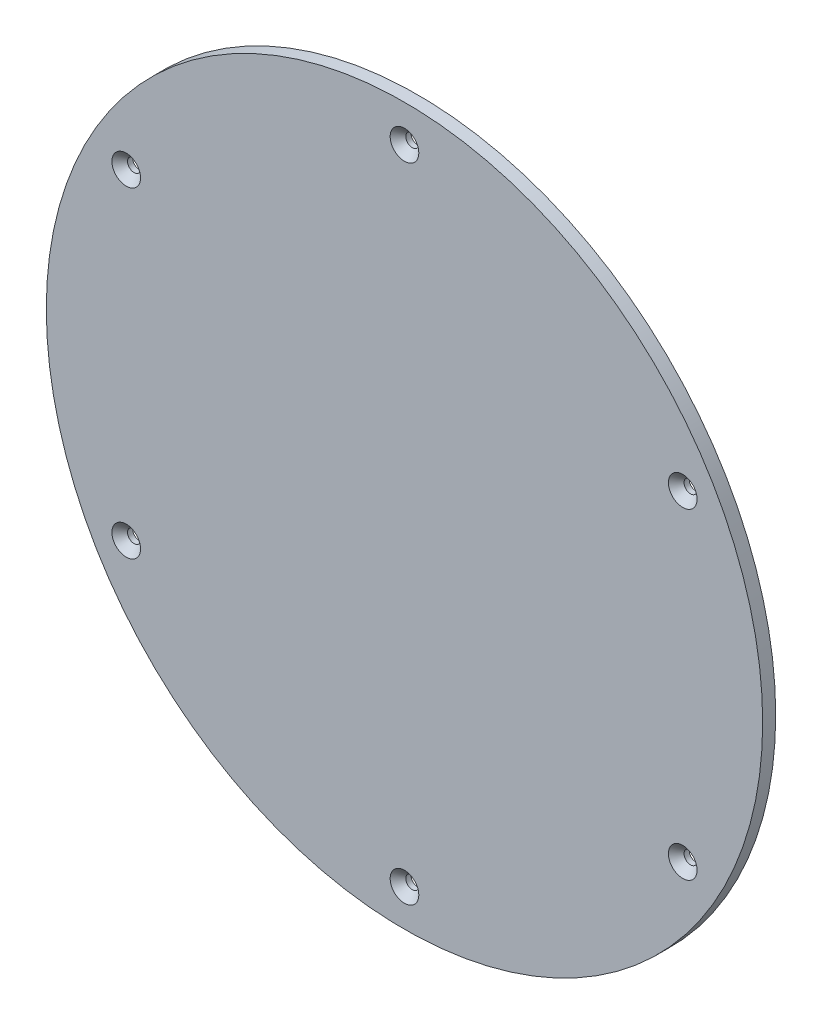
ISO-10303-21;
HEADER;
FILE_DESCRIPTION(('STEP AP214'),'2;1');
FILE_NAME('part.step','',(''),(''),'','','');
FILE_SCHEMA(('AUTOMOTIVE_DESIGN { 1 0 10303 214 1 1 1 1 }'));
ENDSEC;
DATA;
#1=APPLICATION_CONTEXT('core data for automotive mechanical design processes');
#2=APPLICATION_PROTOCOL_DEFINITION('international standard','automotive_design',2000,#1);
#3=PRODUCT_CONTEXT('',#1,'mechanical');
#4=PRODUCT('Part','Part','',(#3));
#5=PRODUCT_RELATED_PRODUCT_CATEGORY('part','',(#4));
#6=PRODUCT_DEFINITION_FORMATION('','',#4);
#7=PRODUCT_DEFINITION_CONTEXT('part definition',#1,'design');
#8=PRODUCT_DEFINITION('design','',#6,#7);
#9=PRODUCT_DEFINITION_SHAPE('','',#8);
#10=(LENGTH_UNIT() NAMED_UNIT(*) SI_UNIT(.MILLI.,.METRE.));
#11=(NAMED_UNIT(*) PLANE_ANGLE_UNIT() SI_UNIT($,.RADIAN.));
#12=(NAMED_UNIT(*) SI_UNIT($,.STERADIAN.) SOLID_ANGLE_UNIT());
#13=UNCERTAINTY_MEASURE_WITH_UNIT(LENGTH_MEASURE(1.E-05),#10,'distance_accuracy_value','');
#14=(GEOMETRIC_REPRESENTATION_CONTEXT(3) GLOBAL_UNCERTAINTY_ASSIGNED_CONTEXT((#13)) GLOBAL_UNIT_ASSIGNED_CONTEXT((#10,
#11,#12)) REPRESENTATION_CONTEXT('',''));
#15=CARTESIAN_POINT('',(0.,0.,0.));
#16=DIRECTION('',(0.,0.,1.));
#17=DIRECTION('',(1.,0.,0.));
#18=AXIS2_PLACEMENT_3D('',#15,#16,#17);
#19=CARTESIAN_POINT('',(0.,0.,3.));
#20=DIRECTION('',(0.,0.,1.));
#21=DIRECTION('',(1.,0.,0.));
#22=AXIS2_PLACEMENT_3D('',#19,#20,#21);
#23=PLANE('',#22);
#24=CARTESIAN_POINT('',(-64.0858798800485,-36.9999999999999,3.));
#25=DIRECTION('',(0.,0.,1.));
#26=DIRECTION('',(1.,0.,0.));
#27=AXIS2_PLACEMENT_3D('',#24,#25,#26);
#28=CIRCLE('',#27,3.29999999999991);
#29=CARTESIAN_POINT('',(-60.7858798800486,-36.9999999999999,3.));
#30=VERTEX_POINT('',#29);
#31=EDGE_CURVE('E61',#30,#30,#28,.F.);
#32=ORIENTED_EDGE('',*,*,#31,.T.);
#33=EDGE_LOOP('',(#32));
#34=FACE_BOUND('',#33,.T.);
#35=CARTESIAN_POINT('',(0.,-74.,3.));
#36=DIRECTION('',(0.,0.,1.));
#37=DIRECTION('',(1.,0.,0.));
#38=AXIS2_PLACEMENT_3D('',#35,#36,#37);
#39=CIRCLE('',#38,3.3);
#40=CARTESIAN_POINT('',(3.3,-74.,3.));
#41=VERTEX_POINT('',#40);
#42=EDGE_CURVE('E64',#41,#41,#39,.F.);
#43=ORIENTED_EDGE('',*,*,#42,.T.);
#44=EDGE_LOOP('',(#43));
#45=FACE_BOUND('',#44,.T.);
#46=CARTESIAN_POINT('',(64.0858798800485,-36.9999999999999,3.));
#47=DIRECTION('',(0.,0.,1.));
#48=DIRECTION('',(1.,0.,0.));
#49=AXIS2_PLACEMENT_3D('',#46,#47,#48);
#50=CIRCLE('',#49,3.29999999999994);
#51=CARTESIAN_POINT('',(67.3858798800485,-36.9999999999999,3.));
#52=VERTEX_POINT('',#51);
#53=EDGE_CURVE('E67',#52,#52,#50,.F.);
#54=ORIENTED_EDGE('',*,*,#53,.T.);
#55=EDGE_LOOP('',(#54));
#56=FACE_BOUND('',#55,.T.);
#57=CARTESIAN_POINT('',(64.0858798800485,36.9999999999999,3.));
#58=DIRECTION('',(0.,0.,1.));
#59=DIRECTION('',(1.,0.,0.));
#60=AXIS2_PLACEMENT_3D('',#57,#58,#59);
#61=CIRCLE('',#60,3.29999999999994);
#62=CARTESIAN_POINT('',(67.3858798800485,36.9999999999999,3.));
#63=VERTEX_POINT('',#62);
#64=EDGE_CURVE('E70',#63,#63,#61,.F.);
#65=ORIENTED_EDGE('',*,*,#64,.T.);
#66=EDGE_LOOP('',(#65));
#67=FACE_BOUND('',#66,.T.);
#68=CARTESIAN_POINT('',(0.,74.,3.));
#69=DIRECTION('',(0.,0.,1.));
#70=DIRECTION('',(1.,0.,0.));
#71=AXIS2_PLACEMENT_3D('',#68,#69,#70);
#72=CIRCLE('',#71,3.3);
#73=CARTESIAN_POINT('',(3.3,74.,3.));
#74=VERTEX_POINT('',#73);
#75=EDGE_CURVE('E74',#74,#74,#72,.F.);
#76=ORIENTED_EDGE('',*,*,#75,.T.);
#77=EDGE_LOOP('',(#76));
#78=FACE_BOUND('',#77,.T.);
#79=CARTESIAN_POINT('',(-64.0858798800485,36.9999999999999,3.));
#80=DIRECTION('',(0.,0.,1.));
#81=DIRECTION('',(1.,0.,0.));
#82=AXIS2_PLACEMENT_3D('',#79,#80,#81);
#83=CIRCLE('',#82,3.29999999999991);
#84=CARTESIAN_POINT('',(-60.7858798800486,36.9999999999999,3.));
#85=VERTEX_POINT('',#84);
#86=EDGE_CURVE('E77',#85,#85,#83,.F.);
#87=ORIENTED_EDGE('',*,*,#86,.T.);
#88=EDGE_LOOP('',(#87));
#89=FACE_BOUND('',#88,.T.);
#90=CARTESIAN_POINT('',(0.,0.,3.));
#91=DIRECTION('',(0.,0.,1.));
#92=DIRECTION('',(1.,0.,0.));
#93=AXIS2_PLACEMENT_3D('',#90,#91,#92);
#94=CIRCLE('',#93,82.5);
#95=CARTESIAN_POINT('',(82.5,0.,3.));
#96=VERTEX_POINT('',#95);
#97=EDGE_CURVE('E83',#96,#96,#94,.T.);
#98=ORIENTED_EDGE('',*,*,#97,.T.);
#99=EDGE_LOOP('',(#98));
#100=FACE_BOUND('',#99,.T.);
#101=ADVANCED_FACE('F37',(#34,#45,#56,#67,#78,#89,#100),#23,.T.);
#102=CARTESIAN_POINT('',(0.,0.,0.));
#103=DIRECTION('',(0.,0.,1.));
#104=DIRECTION('',(1.,0.,0.));
#105=AXIS2_PLACEMENT_3D('',#102,#103,#104);
#106=PLANE('',#105);
#107=CARTESIAN_POINT('',(0.,0.,0.));
#108=DIRECTION('',(0.,0.,1.));
#109=DIRECTION('',(1.,0.,0.));
#110=AXIS2_PLACEMENT_3D('',#107,#108,#109);
#111=CIRCLE('',#110,82.5);
#112=CARTESIAN_POINT('',(82.5,0.,0.));
#113=VERTEX_POINT('',#112);
#114=EDGE_CURVE('E84',#113,#113,#111,.T.);
#115=ORIENTED_EDGE('',*,*,#114,.F.);
#116=EDGE_LOOP('',(#115));
#117=FACE_BOUND('',#116,.T.);
#118=CARTESIAN_POINT('',(0.,74.,0.));
#119=DIRECTION('',(0.,0.,1.));
#120=DIRECTION('',(1.,0.,0.));
#121=AXIS2_PLACEMENT_3D('',#118,#119,#120);
#122=CIRCLE('',#121,1.5);
#123=CARTESIAN_POINT('',(1.5,74.,0.));
#124=VERTEX_POINT('',#123);
#125=EDGE_CURVE('E88',#124,#124,#122,.T.);
#126=ORIENTED_EDGE('',*,*,#125,.T.);
#127=EDGE_LOOP('',(#126));
#128=FACE_BOUND('',#127,.T.);
#129=CARTESIAN_POINT('',(0.,-74.,0.));
#130=DIRECTION('',(0.,0.,1.));
#131=DIRECTION('',(1.,0.,0.));
#132=AXIS2_PLACEMENT_3D('',#129,#130,#131);
#133=CIRCLE('',#132,1.5);
#134=CARTESIAN_POINT('',(1.5,-74.,0.));
#135=VERTEX_POINT('',#134);
#136=EDGE_CURVE('E94',#135,#135,#133,.T.);
#137=ORIENTED_EDGE('',*,*,#136,.T.);
#138=EDGE_LOOP('',(#137));
#139=FACE_BOUND('',#138,.T.);
#140=CARTESIAN_POINT('',(64.0858798800485,36.9999999999999,0.));
#141=DIRECTION('',(0.,0.,1.));
#142=DIRECTION('',(1.,0.,0.));
#143=AXIS2_PLACEMENT_3D('',#140,#141,#142);
#144=CIRCLE('',#143,1.49999999999998);
#145=CARTESIAN_POINT('',(65.5858798800485,36.9999999999999,0.));
#146=VERTEX_POINT('',#145);
#147=EDGE_CURVE('E97',#146,#146,#144,.T.);
#148=ORIENTED_EDGE('',*,*,#147,.T.);
#149=EDGE_LOOP('',(#148));
#150=FACE_BOUND('',#149,.T.);
#151=CARTESIAN_POINT('',(64.0858798800485,-36.9999999999999,0.));
#152=DIRECTION('',(0.,0.,1.));
#153=DIRECTION('',(1.,0.,0.));
#154=AXIS2_PLACEMENT_3D('',#151,#152,#153);
#155=CIRCLE('',#154,1.49999999999998);
#156=CARTESIAN_POINT('',(65.5858798800485,-36.9999999999999,0.));
#157=VERTEX_POINT('',#156);
#158=EDGE_CURVE('E101',#157,#157,#155,.T.);
#159=ORIENTED_EDGE('',*,*,#158,.T.);
#160=EDGE_LOOP('',(#159));
#161=FACE_BOUND('',#160,.T.);
#162=CARTESIAN_POINT('',(-64.0858798800485,-36.9999999999999,0.));
#163=DIRECTION('',(0.,0.,1.));
#164=DIRECTION('',(1.,0.,0.));
#165=AXIS2_PLACEMENT_3D('',#162,#163,#164);
#166=CIRCLE('',#165,1.5);
#167=CARTESIAN_POINT('',(-62.5858798800485,-36.9999999999999,0.));
#168=VERTEX_POINT('',#167);
#169=EDGE_CURVE('E104',#168,#168,#166,.T.);
#170=ORIENTED_EDGE('',*,*,#169,.T.);
#171=EDGE_LOOP('',(#170));
#172=FACE_BOUND('',#171,.T.);
#173=CARTESIAN_POINT('',(-64.0858798800485,36.9999999999999,0.));
#174=DIRECTION('',(0.,0.,1.));
#175=DIRECTION('',(1.,0.,0.));
#176=AXIS2_PLACEMENT_3D('',#173,#174,#175);
#177=CIRCLE('',#176,1.5);
#178=CARTESIAN_POINT('',(-62.5858798800485,36.9999999999999,0.));
#179=VERTEX_POINT('',#178);
#180=EDGE_CURVE('E107',#179,#179,#177,.T.);
#181=ORIENTED_EDGE('',*,*,#180,.T.);
#182=EDGE_LOOP('',(#181));
#183=FACE_BOUND('',#182,.T.);
#184=ADVANCED_FACE('F111',(#117,#128,#139,#150,#161,#172,#183),#106,.F.);
#185=CARTESIAN_POINT('',(0.,0.,3.));
#186=DIRECTION('',(0.,0.,-1.));
#187=DIRECTION('',(-1.,0.,0.));
#188=AXIS2_PLACEMENT_3D('',#185,#186,#187);
#189=CYLINDRICAL_SURFACE('',#188,82.5);
#190=ORIENTED_EDGE('',*,*,#97,.F.);
#191=EDGE_LOOP('',(#190));
#192=FACE_BOUND('',#191,.T.);
#193=ORIENTED_EDGE('',*,*,#114,.T.);
#194=EDGE_LOOP('',(#193));
#195=FACE_BOUND('',#194,.T.);
#196=ADVANCED_FACE('F134',(#192,#195),#189,.T.);
#197=CARTESIAN_POINT('',(0.,74.,3.));
#198=DIRECTION('',(0.,0.,-1.));
#199=DIRECTION('',(-1.,0.,0.));
#200=AXIS2_PLACEMENT_3D('',#197,#198,#199);
#201=CYLINDRICAL_SURFACE('',#200,1.5);
#202=CARTESIAN_POINT('',(0.,74.,1.20000000000003));
#203=DIRECTION('',(0.,0.,1.));
#204=DIRECTION('',(1.,0.,0.));
#205=AXIS2_PLACEMENT_3D('',#202,#203,#204);
#206=CIRCLE('',#205,1.5);
#207=CARTESIAN_POINT('',(1.5,74.,1.20000000000003));
#208=VERTEX_POINT('',#207);
#209=EDGE_CURVE('E44',#208,#208,#206,.T.);
#210=ORIENTED_EDGE('',*,*,#209,.T.);
#211=EDGE_LOOP('',(#210));
#212=FACE_BOUND('',#211,.T.);
#213=ORIENTED_EDGE('',*,*,#125,.F.);
#214=EDGE_LOOP('',(#213));
#215=FACE_BOUND('',#214,.T.);
#216=ADVANCED_FACE('F139',(#212,#215),#201,.F.);
#217=CARTESIAN_POINT('',(0.,-74.,3.));
#218=DIRECTION('',(0.,0.,-1.));
#219=DIRECTION('',(-1.,0.,0.));
#220=AXIS2_PLACEMENT_3D('',#217,#218,#219);
#221=CYLINDRICAL_SURFACE('',#220,1.5);
#222=CARTESIAN_POINT('',(0.,-74.,1.20000000000003));
#223=DIRECTION('',(0.,0.,1.));
#224=DIRECTION('',(1.,0.,0.));
#225=AXIS2_PLACEMENT_3D('',#222,#223,#224);
#226=CIRCLE('',#225,1.5);
#227=CARTESIAN_POINT('',(1.5,-74.,1.20000000000003));
#228=VERTEX_POINT('',#227);
#229=EDGE_CURVE('E58',#228,#228,#226,.T.);
#230=ORIENTED_EDGE('',*,*,#229,.T.);
#231=EDGE_LOOP('',(#230));
#232=FACE_BOUND('',#231,.T.);
#233=ORIENTED_EDGE('',*,*,#136,.F.);
#234=EDGE_LOOP('',(#233));
#235=FACE_BOUND('',#234,.T.);
#236=ADVANCED_FACE('F190',(#232,#235),#221,.F.);
#237=CARTESIAN_POINT('',(64.0858798800485,36.9999999999999,3.));
#238=DIRECTION('',(0.,0.,-1.));
#239=DIRECTION('',(-1.,0.,0.));
#240=AXIS2_PLACEMENT_3D('',#237,#238,#239);
#241=CYLINDRICAL_SURFACE('',#240,1.49999999999998);
#242=CARTESIAN_POINT('',(64.0858798800485,36.9999999999999,1.20000000000004));
#243=DIRECTION('',(0.,0.,1.));
#244=DIRECTION('',(1.,0.,0.));
#245=AXIS2_PLACEMENT_3D('',#242,#243,#244);
#246=CIRCLE('',#245,1.49999999999998);
#247=CARTESIAN_POINT('',(65.5858798800485,36.9999999999999,1.20000000000004));
#248=VERTEX_POINT('',#247);
#249=EDGE_CURVE('E48',#248,#248,#246,.T.);
#250=ORIENTED_EDGE('',*,*,#249,.T.);
#251=EDGE_LOOP('',(#250));
#252=FACE_BOUND('',#251,.T.);
#253=ORIENTED_EDGE('',*,*,#147,.F.);
#254=EDGE_LOOP('',(#253));
#255=FACE_BOUND('',#254,.T.);
#256=ADVANCED_FACE('F184',(#252,#255),#241,.F.);
#257=CARTESIAN_POINT('',(64.0858798800485,-36.9999999999999,3.));
#258=DIRECTION('',(0.,0.,-1.));
#259=DIRECTION('',(-1.,0.,0.));
#260=AXIS2_PLACEMENT_3D('',#257,#258,#259);
#261=CYLINDRICAL_SURFACE('',#260,1.49999999999998);
#262=CARTESIAN_POINT('',(64.0858798800485,-36.9999999999999,1.20000000000004));
#263=DIRECTION('',(0.,0.,1.));
#264=DIRECTION('',(1.,0.,0.));
#265=AXIS2_PLACEMENT_3D('',#262,#263,#264);
#266=CIRCLE('',#265,1.49999999999998);
#267=CARTESIAN_POINT('',(65.5858798800485,-36.9999999999999,1.20000000000004));
#268=VERTEX_POINT('',#267);
#269=EDGE_CURVE('E53',#268,#268,#266,.T.);
#270=ORIENTED_EDGE('',*,*,#269,.T.);
#271=EDGE_LOOP('',(#270));
#272=FACE_BOUND('',#271,.T.);
#273=ORIENTED_EDGE('',*,*,#158,.F.);
#274=EDGE_LOOP('',(#273));
#275=FACE_BOUND('',#274,.T.);
#276=ADVANCED_FACE('F125',(#272,#275),#261,.F.);
#277=CARTESIAN_POINT('',(-64.0858798800485,-36.9999999999999,3.));
#278=DIRECTION('',(0.,0.,-1.));
#279=DIRECTION('',(-1.,0.,0.));
#280=AXIS2_PLACEMENT_3D('',#277,#278,#279);
#281=CYLINDRICAL_SURFACE('',#280,1.5);
#282=CARTESIAN_POINT('',(-64.0858798800485,-36.9999999999999,1.20000000000008));
#283=DIRECTION('',(0.,0.,1.));
#284=DIRECTION('',(1.,0.,0.));
#285=AXIS2_PLACEMENT_3D('',#282,#283,#284);
#286=CIRCLE('',#285,1.5);
#287=CARTESIAN_POINT('',(-62.5858798800485,-36.9999999999999,1.20000000000008));
#288=VERTEX_POINT('',#287);
#289=EDGE_CURVE('E80',#288,#288,#286,.T.);
#290=ORIENTED_EDGE('',*,*,#289,.T.);
#291=EDGE_LOOP('',(#290));
#292=FACE_BOUND('',#291,.T.);
#293=ORIENTED_EDGE('',*,*,#169,.F.);
#294=EDGE_LOOP('',(#293));
#295=FACE_BOUND('',#294,.T.);
#296=ADVANCED_FACE('F116',(#292,#295),#281,.F.);
#297=CARTESIAN_POINT('',(-64.0858798800485,36.9999999999999,3.));
#298=DIRECTION('',(0.,0.,-1.));
#299=DIRECTION('',(-1.,0.,0.));
#300=AXIS2_PLACEMENT_3D('',#297,#298,#299);
#301=CYLINDRICAL_SURFACE('',#300,1.5);
#302=CARTESIAN_POINT('',(-64.0858798800485,36.9999999999999,1.20000000000008));
#303=DIRECTION('',(0.,0.,1.));
#304=DIRECTION('',(1.,0.,0.));
#305=AXIS2_PLACEMENT_3D('',#302,#303,#304);
#306=CIRCLE('',#305,1.5);
#307=CARTESIAN_POINT('',(-62.5858798800485,36.9999999999999,1.20000000000008));
#308=VERTEX_POINT('',#307);
#309=EDGE_CURVE('E10',#308,#308,#306,.T.);
#310=ORIENTED_EDGE('',*,*,#309,.T.);
#311=EDGE_LOOP('',(#310));
#312=FACE_BOUND('',#311,.T.);
#313=ORIENTED_EDGE('',*,*,#180,.F.);
#314=EDGE_LOOP('',(#313));
#315=FACE_BOUND('',#314,.T.);
#316=ADVANCED_FACE('F113',(#312,#315),#301,.F.);
#317=CARTESIAN_POINT('',(-64.0858798800485,-36.9999999999999,1.20000000000008));
#318=DIRECTION('',(0.,0.,1.));
#319=DIRECTION('',(1.,0.,0.));
#320=AXIS2_PLACEMENT_3D('',#317,#318,#319);
#321=CONICAL_SURFACE('',#320,1.5,0.785398163397447);
#322=ORIENTED_EDGE('',*,*,#31,.F.);
#323=EDGE_LOOP('',(#322));
#324=FACE_BOUND('',#323,.T.);
#325=ORIENTED_EDGE('',*,*,#289,.F.);
#326=EDGE_LOOP('',(#325));
#327=FACE_BOUND('',#326,.T.);
#328=ADVANCED_FACE('F115',(#324,#327),#321,.F.);
#329=CARTESIAN_POINT('',(0.,-74.,1.20000000000003));
#330=DIRECTION('',(0.,0.,1.));
#331=DIRECTION('',(1.,0.,0.));
#332=AXIS2_PLACEMENT_3D('',#329,#330,#331);
#333=CONICAL_SURFACE('',#332,1.5,0.785398163397455);
#334=ORIENTED_EDGE('',*,*,#42,.F.);
#335=EDGE_LOOP('',(#334));
#336=FACE_BOUND('',#335,.T.);
#337=ORIENTED_EDGE('',*,*,#229,.F.);
#338=EDGE_LOOP('',(#337));
#339=FACE_BOUND('',#338,.T.);
#340=ADVANCED_FACE('F122',(#336,#339),#333,.F.);
#341=CARTESIAN_POINT('',(64.0858798800485,-36.9999999999999,1.20000000000004));
#342=DIRECTION('',(0.,0.,1.));
#343=DIRECTION('',(1.,0.,0.));
#344=AXIS2_PLACEMENT_3D('',#341,#342,#343);
#345=CONICAL_SURFACE('',#344,1.49999999999998,0.785398163397445);
#346=ORIENTED_EDGE('',*,*,#53,.F.);
#347=EDGE_LOOP('',(#346));
#348=FACE_BOUND('',#347,.T.);
#349=ORIENTED_EDGE('',*,*,#269,.F.);
#350=EDGE_LOOP('',(#349));
#351=FACE_BOUND('',#350,.T.);
#352=ADVANCED_FACE('F147',(#348,#351),#345,.F.);
#353=CARTESIAN_POINT('',(64.0858798800485,36.9999999999999,1.20000000000004));
#354=DIRECTION('',(0.,0.,1.));
#355=DIRECTION('',(1.,0.,0.));
#356=AXIS2_PLACEMENT_3D('',#353,#354,#355);
#357=CONICAL_SURFACE('',#356,1.49999999999998,0.785398163397445);
#358=ORIENTED_EDGE('',*,*,#64,.F.);
#359=EDGE_LOOP('',(#358));
#360=FACE_BOUND('',#359,.T.);
#361=ORIENTED_EDGE('',*,*,#249,.F.);
#362=EDGE_LOOP('',(#361));
#363=FACE_BOUND('',#362,.T.);
#364=ADVANCED_FACE('F151',(#360,#363),#357,.F.);
#365=CARTESIAN_POINT('',(0.,74.,1.20000000000003));
#366=DIRECTION('',(0.,0.,1.));
#367=DIRECTION('',(1.,0.,0.));
#368=AXIS2_PLACEMENT_3D('',#365,#366,#367);
#369=CONICAL_SURFACE('',#368,1.5,0.785398163397455);
#370=ORIENTED_EDGE('',*,*,#75,.F.);
#371=EDGE_LOOP('',(#370));
#372=FACE_BOUND('',#371,.T.);
#373=ORIENTED_EDGE('',*,*,#209,.F.);
#374=EDGE_LOOP('',(#373));
#375=FACE_BOUND('',#374,.T.);
#376=ADVANCED_FACE('F154',(#372,#375),#369,.F.);
#377=CARTESIAN_POINT('',(-64.0858798800485,36.9999999999999,1.20000000000008));
#378=DIRECTION('',(0.,0.,1.));
#379=DIRECTION('',(1.,0.,0.));
#380=AXIS2_PLACEMENT_3D('',#377,#378,#379);
#381=CONICAL_SURFACE('',#380,1.5,0.785398163397447);
#382=ORIENTED_EDGE('',*,*,#86,.F.);
#383=EDGE_LOOP('',(#382));
#384=FACE_BOUND('',#383,.T.);
#385=ORIENTED_EDGE('',*,*,#309,.F.);
#386=EDGE_LOOP('',(#385));
#387=FACE_BOUND('',#386,.T.);
#388=ADVANCED_FACE('F39',(#384,#387),#381,.F.);
#389=CLOSED_SHELL('',(#101,#184,#196,#216,#236,#256,#276,#296,#316,#328,#340,#352,#364,#376,#388));
#390=MANIFOLD_SOLID_BREP('B2',#389);
#391=ADVANCED_BREP_SHAPE_REPRESENTATION('',(#18,#390),#14);
#392=SHAPE_DEFINITION_REPRESENTATION(#9,#391);
ENDSEC;
END-ISO-10303-21;
